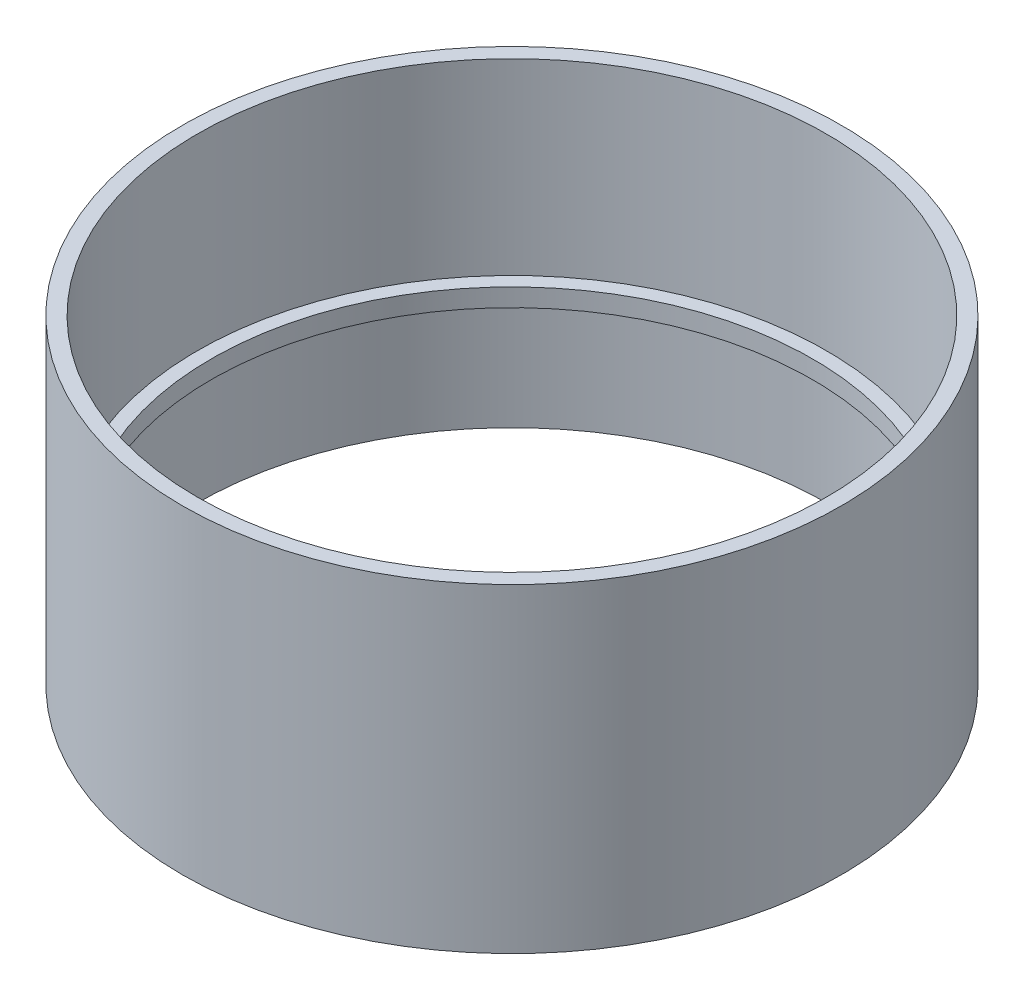
ISO-10303-21;
HEADER;
FILE_DESCRIPTION(('STEP AP214'),'2;1');
FILE_NAME('part.step','',(''),(''),'','','');
FILE_SCHEMA(('AUTOMOTIVE_DESIGN { 1 0 10303 214 1 1 1 1 }'));
ENDSEC;
DATA;
#1=APPLICATION_CONTEXT('core data for automotive mechanical design processes');
#2=APPLICATION_PROTOCOL_DEFINITION('international standard','automotive_design',2000,#1);
#3=PRODUCT_CONTEXT('',#1,'mechanical');
#4=PRODUCT('Part','Part','',(#3));
#5=PRODUCT_RELATED_PRODUCT_CATEGORY('part','',(#4));
#6=PRODUCT_DEFINITION_FORMATION('','',#4);
#7=PRODUCT_DEFINITION_CONTEXT('part definition',#1,'design');
#8=PRODUCT_DEFINITION('design','',#6,#7);
#9=PRODUCT_DEFINITION_SHAPE('','',#8);
#10=(LENGTH_UNIT() NAMED_UNIT(*) SI_UNIT(.MILLI.,.METRE.));
#11=(NAMED_UNIT(*) PLANE_ANGLE_UNIT() SI_UNIT($,.RADIAN.));
#12=(NAMED_UNIT(*) SI_UNIT($,.STERADIAN.) SOLID_ANGLE_UNIT());
#13=UNCERTAINTY_MEASURE_WITH_UNIT(LENGTH_MEASURE(1.E-05),#10,'distance_accuracy_value','');
#14=(GEOMETRIC_REPRESENTATION_CONTEXT(3) GLOBAL_UNCERTAINTY_ASSIGNED_CONTEXT((#13)) GLOBAL_UNIT_ASSIGNED_CONTEXT((#10,
#11,#12)) REPRESENTATION_CONTEXT('',''));
#15=CARTESIAN_POINT('',(0.,0.,0.));
#16=DIRECTION('',(0.,0.,1.));
#17=DIRECTION('',(1.,0.,0.));
#18=AXIS2_PLACEMENT_3D('',#15,#16,#17);
#19=CARTESIAN_POINT('',(0.,-81.28,0.));
#20=DIRECTION('',(0.,1.,0.));
#21=DIRECTION('',(0.,0.,1.));
#22=AXIS2_PLACEMENT_3D('',#19,#20,#21);
#23=CYLINDRICAL_SURFACE('',#22,80.01);
#24=CARTESIAN_POINT('',(0.,-81.28,0.));
#25=DIRECTION('',(0.,1.,0.));
#26=DIRECTION('',(0.,0.,1.));
#27=AXIS2_PLACEMENT_3D('',#24,#25,#26);
#28=CIRCLE('',#27,80.01);
#29=CARTESIAN_POINT('',(0.,-81.28,80.01));
#30=VERTEX_POINT('',#29);
#31=EDGE_CURVE('E48',#30,#30,#28,.T.);
#32=ORIENTED_EDGE('',*,*,#31,.F.);
#33=EDGE_LOOP('',(#32));
#34=FACE_BOUND('',#33,.T.);
#35=CARTESIAN_POINT('',(0.,-52.324,0.));
#36=DIRECTION('',(0.,1.,0.));
#37=DIRECTION('',(0.,0.,1.));
#38=AXIS2_PLACEMENT_3D('',#35,#36,#37);
#39=CIRCLE('',#38,80.01);
#40=CARTESIAN_POINT('',(0.,-52.324,80.01));
#41=VERTEX_POINT('',#40);
#42=EDGE_CURVE('E10',#41,#41,#39,.F.);
#43=ORIENTED_EDGE('',*,*,#42,.F.);
#44=EDGE_LOOP('',(#43));
#45=FACE_BOUND('',#44,.T.);
#46=ADVANCED_FACE('F32',(#34,#45),#23,.F.);
#47=CARTESIAN_POINT('',(0.,-81.28,0.));
#48=DIRECTION('',(0.,1.,0.));
#49=DIRECTION('',(0.,0.,1.));
#50=AXIS2_PLACEMENT_3D('',#47,#48,#49);
#51=CYLINDRICAL_SURFACE('',#50,83.82);
#52=CARTESIAN_POINT('',(0.,-81.28,0.));
#53=DIRECTION('',(0.,1.,0.));
#54=DIRECTION('',(0.,0.,1.));
#55=AXIS2_PLACEMENT_3D('',#52,#53,#54);
#56=CIRCLE('',#55,83.82);
#57=CARTESIAN_POINT('',(0.,-81.28,83.82));
#58=VERTEX_POINT('',#57);
#59=EDGE_CURVE('E39',#58,#58,#56,.T.);
#60=ORIENTED_EDGE('',*,*,#59,.T.);
#61=EDGE_LOOP('',(#60));
#62=FACE_BOUND('',#61,.T.);
#63=CARTESIAN_POINT('',(0.,0.,0.));
#64=DIRECTION('',(0.,1.,0.));
#65=DIRECTION('',(0.,0.,1.));
#66=AXIS2_PLACEMENT_3D('',#63,#64,#65);
#67=CIRCLE('',#66,83.82);
#68=CARTESIAN_POINT('',(0.,0.,83.82));
#69=VERTEX_POINT('',#68);
#70=EDGE_CURVE('E43',#69,#69,#67,.T.);
#71=ORIENTED_EDGE('',*,*,#70,.F.);
#72=EDGE_LOOP('',(#71));
#73=FACE_BOUND('',#72,.T.);
#74=ADVANCED_FACE('F34',(#62,#73),#51,.T.);
#75=CARTESIAN_POINT('',(0.,-81.28,0.));
#76=DIRECTION('',(0.,1.,0.));
#77=DIRECTION('',(0.,0.,1.));
#78=AXIS2_PLACEMENT_3D('',#75,#76,#77);
#79=PLANE('',#78);
#80=ORIENTED_EDGE('',*,*,#31,.T.);
#81=EDGE_LOOP('',(#80));
#82=FACE_BOUND('',#81,.T.);
#83=ORIENTED_EDGE('',*,*,#59,.F.);
#84=EDGE_LOOP('',(#83));
#85=FACE_BOUND('',#84,.T.);
#86=ADVANCED_FACE('F88',(#82,#85),#79,.F.);
#87=CARTESIAN_POINT('',(0.,0.,0.));
#88=DIRECTION('',(0.,1.,0.));
#89=DIRECTION('',(0.,0.,1.));
#90=AXIS2_PLACEMENT_3D('',#87,#88,#89);
#91=PLANE('',#90);
#92=CARTESIAN_POINT('',(0.,0.,0.));
#93=DIRECTION('',(0.,1.,0.));
#94=DIRECTION('',(0.,0.,1.));
#95=AXIS2_PLACEMENT_3D('',#92,#93,#94);
#96=CIRCLE('',#95,80.01);
#97=CARTESIAN_POINT('',(0.,0.,80.01));
#98=VERTEX_POINT('',#97);
#99=EDGE_CURVE('E50',#98,#98,#96,.T.);
#100=ORIENTED_EDGE('',*,*,#99,.F.);
#101=EDGE_LOOP('',(#100));
#102=FACE_BOUND('',#101,.T.);
#103=ORIENTED_EDGE('',*,*,#70,.T.);
#104=EDGE_LOOP('',(#103));
#105=FACE_BOUND('',#104,.T.);
#106=ADVANCED_FACE('F82',(#102,#105),#91,.T.);
#107=CARTESIAN_POINT('',(0.,-47.752,0.));
#108=DIRECTION('',(0.,1.,0.));
#109=DIRECTION('',(0.,0.,1.));
#110=AXIS2_PLACEMENT_3D('',#107,#108,#109);
#111=CIRCLE('',#110,80.01);
#112=CARTESIAN_POINT('',(0.,-47.752,80.01));
#113=VERTEX_POINT('',#112);
#114=EDGE_CURVE('E53',#113,#113,#111,.T.);
#115=ORIENTED_EDGE('',*,*,#114,.F.);
#116=EDGE_LOOP('',(#115));
#117=FACE_BOUND('',#116,.T.);
#118=ORIENTED_EDGE('',*,*,#99,.T.);
#119=EDGE_LOOP('',(#118));
#120=FACE_BOUND('',#119,.T.);
#121=ADVANCED_FACE('F79',(#117,#120),#23,.F.);
#122=CARTESIAN_POINT('',(0.,-52.324,0.));
#123=DIRECTION('',(0.,1.,0.));
#124=DIRECTION('',(0.,0.,1.));
#125=AXIS2_PLACEMENT_3D('',#122,#123,#124);
#126=PLANE('',#125);
#127=CARTESIAN_POINT('',(0.,-52.324,0.));
#128=DIRECTION('',(0.,1.,0.));
#129=DIRECTION('',(0.,0.,1.));
#130=AXIS2_PLACEMENT_3D('',#127,#128,#129);
#131=CIRCLE('',#130,76.454);
#132=CARTESIAN_POINT('',(0.,-52.324,76.454));
#133=VERTEX_POINT('',#132);
#134=EDGE_CURVE('E58',#133,#133,#131,.T.);
#135=ORIENTED_EDGE('',*,*,#134,.T.);
#136=EDGE_LOOP('',(#135));
#137=FACE_BOUND('',#136,.T.);
#138=ORIENTED_EDGE('',*,*,#42,.T.);
#139=EDGE_LOOP('',(#138));
#140=FACE_BOUND('',#139,.T.);
#141=ADVANCED_FACE('F65',(#137,#140),#126,.F.);
#142=CARTESIAN_POINT('',(0.,-47.752,0.));
#143=DIRECTION('',(0.,1.,0.));
#144=DIRECTION('',(0.,0.,1.));
#145=AXIS2_PLACEMENT_3D('',#142,#143,#144);
#146=PLANE('',#145);
#147=CARTESIAN_POINT('',(0.,-47.752,0.));
#148=DIRECTION('',(0.,1.,0.));
#149=DIRECTION('',(0.,0.,1.));
#150=AXIS2_PLACEMENT_3D('',#147,#148,#149);
#151=CIRCLE('',#150,76.454);
#152=CARTESIAN_POINT('',(0.,-47.752,76.454));
#153=VERTEX_POINT('',#152);
#154=EDGE_CURVE('E59',#153,#153,#151,.T.);
#155=ORIENTED_EDGE('',*,*,#154,.F.);
#156=EDGE_LOOP('',(#155));
#157=FACE_BOUND('',#156,.T.);
#158=ORIENTED_EDGE('',*,*,#114,.T.);
#159=EDGE_LOOP('',(#158));
#160=FACE_BOUND('',#159,.T.);
#161=ADVANCED_FACE('F70',(#157,#160),#146,.T.);
#162=CARTESIAN_POINT('',(0.,-52.324,0.));
#163=DIRECTION('',(0.,1.,0.));
#164=DIRECTION('',(0.,0.,1.));
#165=AXIS2_PLACEMENT_3D('',#162,#163,#164);
#166=CYLINDRICAL_SURFACE('',#165,76.454);
#167=ORIENTED_EDGE('',*,*,#134,.F.);
#168=EDGE_LOOP('',(#167));
#169=FACE_BOUND('',#168,.T.);
#170=ORIENTED_EDGE('',*,*,#154,.T.);
#171=EDGE_LOOP('',(#170));
#172=FACE_BOUND('',#171,.T.);
#173=ADVANCED_FACE('F67',(#169,#172),#166,.F.);
#174=CLOSED_SHELL('',(#46,#74,#86,#106,#121,#141,#161,#173));
#175=MANIFOLD_SOLID_BREP('B2',#174);
#176=ADVANCED_BREP_SHAPE_REPRESENTATION('',(#18,#175),#14);
#177=SHAPE_DEFINITION_REPRESENTATION(#9,#176);
ENDSEC;
END-ISO-10303-21;
